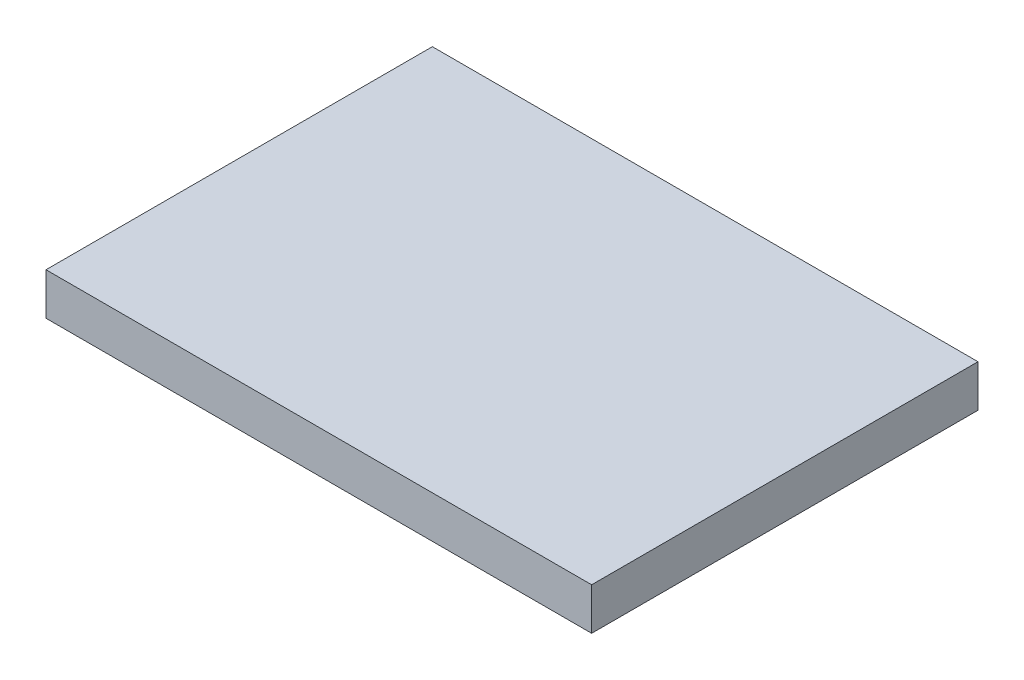
ISO-10303-21;
HEADER;
FILE_DESCRIPTION(('STEP AP214'),'2;1');
FILE_NAME('part.step','',(''),(''),'','','');
FILE_SCHEMA(('AUTOMOTIVE_DESIGN { 1 0 10303 214 1 1 1 1 }'));
ENDSEC;
DATA;
#1=APPLICATION_CONTEXT('core data for automotive mechanical design processes');
#2=APPLICATION_PROTOCOL_DEFINITION('international standard','automotive_design',2000,#1);
#3=PRODUCT_CONTEXT('',#1,'mechanical');
#4=PRODUCT('Part','Part','',(#3));
#5=PRODUCT_RELATED_PRODUCT_CATEGORY('part','',(#4));
#6=PRODUCT_DEFINITION_FORMATION('','',#4);
#7=PRODUCT_DEFINITION_CONTEXT('part definition',#1,'design');
#8=PRODUCT_DEFINITION('design','',#6,#7);
#9=PRODUCT_DEFINITION_SHAPE('','',#8);
#10=(LENGTH_UNIT() NAMED_UNIT(*) SI_UNIT(.MILLI.,.METRE.));
#11=(NAMED_UNIT(*) PLANE_ANGLE_UNIT() SI_UNIT($,.RADIAN.));
#12=(NAMED_UNIT(*) SI_UNIT($,.STERADIAN.) SOLID_ANGLE_UNIT());
#13=UNCERTAINTY_MEASURE_WITH_UNIT(LENGTH_MEASURE(1.E-05),#10,'distance_accuracy_value','');
#14=(GEOMETRIC_REPRESENTATION_CONTEXT(3) GLOBAL_UNCERTAINTY_ASSIGNED_CONTEXT((#13)) GLOBAL_UNIT_ASSIGNED_CONTEXT((#10,
#11,#12)) REPRESENTATION_CONTEXT('',''));
#15=CARTESIAN_POINT('',(0.,0.,0.));
#16=DIRECTION('',(0.,0.,1.));
#17=DIRECTION('',(1.,0.,0.));
#18=AXIS2_PLACEMENT_3D('',#15,#16,#17);
#19=CARTESIAN_POINT('',(0.,9.,0.));
#20=DIRECTION('',(1.,0.,0.));
#21=DIRECTION('',(0.,0.,-1.));
#22=AXIS2_PLACEMENT_3D('',#19,#20,#21);
#23=PLANE('',#22);
#24=DIRECTION('',(0.,0.,1.));
#25=VECTOR('',#24,1.);
#26=CARTESIAN_POINT('',(0.,0.,0.));
#27=LINE('',#26,#25);
#28=CARTESIAN_POINT('',(0.,0.,-82.7));
#29=VERTEX_POINT('',#28);
#30=CARTESIAN_POINT('',(0.,0.,0.));
#31=VERTEX_POINT('',#30);
#32=EDGE_CURVE('E111',#29,#31,#27,.T.);
#33=ORIENTED_EDGE('',*,*,#32,.T.);
#34=DIRECTION('',(0.,-1.,0.));
#35=VECTOR('',#34,1.);
#36=CARTESIAN_POINT('',(0.,9.,0.));
#37=LINE('',#36,#35);
#38=CARTESIAN_POINT('',(0.,9.,0.));
#39=VERTEX_POINT('',#38);
#40=EDGE_CURVE('E11',#39,#31,#37,.T.);
#41=ORIENTED_EDGE('',*,*,#40,.F.);
#42=DIRECTION('',(0.,0.,1.));
#43=VECTOR('',#42,1.);
#44=CARTESIAN_POINT('',(0.,9.,0.));
#45=LINE('',#44,#43);
#46=CARTESIAN_POINT('',(0.,9.,-82.7));
#47=VERTEX_POINT('',#46);
#48=EDGE_CURVE('E95',#47,#39,#45,.T.);
#49=ORIENTED_EDGE('',*,*,#48,.F.);
#50=DIRECTION('',(0.,-1.,0.));
#51=VECTOR('',#50,1.);
#52=CARTESIAN_POINT('',(0.,9.,-82.7));
#53=LINE('',#52,#51);
#54=EDGE_CURVE('E107',#47,#29,#53,.T.);
#55=ORIENTED_EDGE('',*,*,#54,.T.);
#56=EDGE_LOOP('',(#33,#41,#49,#55));
#57=FACE_BOUND('',#56,.T.);
#58=ADVANCED_FACE('F38',(#57),#23,.F.);
#59=CARTESIAN_POINT('',(0.,9.,0.));
#60=DIRECTION('',(0.,0.,-1.));
#61=DIRECTION('',(-1.,0.,0.));
#62=AXIS2_PLACEMENT_3D('',#59,#60,#61);
#63=PLANE('',#62);
#64=DIRECTION('',(1.,0.,0.));
#65=VECTOR('',#64,1.);
#66=CARTESIAN_POINT('',(0.,0.,0.));
#67=LINE('',#66,#65);
#68=CARTESIAN_POINT('',(116.8,0.,0.));
#69=VERTEX_POINT('',#68);
#70=EDGE_CURVE('E100',#31,#69,#67,.T.);
#71=ORIENTED_EDGE('',*,*,#70,.T.);
#72=DIRECTION('',(0.,-1.,0.));
#73=VECTOR('',#72,1.);
#74=CARTESIAN_POINT('',(116.8,9.,0.));
#75=LINE('',#74,#73);
#76=CARTESIAN_POINT('',(116.8,9.,0.));
#77=VERTEX_POINT('',#76);
#78=EDGE_CURVE('E47',#77,#69,#75,.T.);
#79=ORIENTED_EDGE('',*,*,#78,.F.);
#80=DIRECTION('',(1.,0.,0.));
#81=VECTOR('',#80,1.);
#82=CARTESIAN_POINT('',(0.,9.,0.));
#83=LINE('',#82,#81);
#84=EDGE_CURVE('E90',#39,#77,#83,.T.);
#85=ORIENTED_EDGE('',*,*,#84,.F.);
#86=ORIENTED_EDGE('',*,*,#40,.T.);
#87=EDGE_LOOP('',(#71,#79,#85,#86));
#88=FACE_BOUND('',#87,.T.);
#89=ADVANCED_FACE('F99',(#88),#63,.F.);
#90=CARTESIAN_POINT('',(116.8,9.,0.));
#91=DIRECTION('',(-1.,0.,0.));
#92=DIRECTION('',(0.,0.,1.));
#93=AXIS2_PLACEMENT_3D('',#90,#91,#92);
#94=PLANE('',#93);
#95=DIRECTION('',(0.,0.,-1.));
#96=VECTOR('',#95,1.);
#97=CARTESIAN_POINT('',(116.8,0.,0.));
#98=LINE('',#97,#96);
#99=CARTESIAN_POINT('',(116.8,0.,-82.7));
#100=VERTEX_POINT('',#99);
#101=EDGE_CURVE('E76',#69,#100,#98,.T.);
#102=ORIENTED_EDGE('',*,*,#101,.T.);
#103=DIRECTION('',(0.,-1.,0.));
#104=VECTOR('',#103,1.);
#105=CARTESIAN_POINT('',(116.8,9.,-82.7));
#106=LINE('',#105,#104);
#107=CARTESIAN_POINT('',(116.8,9.,-82.7));
#108=VERTEX_POINT('',#107);
#109=EDGE_CURVE('E102',#108,#100,#106,.T.);
#110=ORIENTED_EDGE('',*,*,#109,.F.);
#111=DIRECTION('',(0.,0.,-1.));
#112=VECTOR('',#111,1.);
#113=CARTESIAN_POINT('',(116.8,9.,0.));
#114=LINE('',#113,#112);
#115=EDGE_CURVE('E93',#77,#108,#114,.T.);
#116=ORIENTED_EDGE('',*,*,#115,.F.);
#117=ORIENTED_EDGE('',*,*,#78,.T.);
#118=EDGE_LOOP('',(#102,#110,#116,#117));
#119=FACE_BOUND('',#118,.T.);
#120=ADVANCED_FACE('F103',(#119),#94,.F.);
#121=CARTESIAN_POINT('',(0.,9.,-82.7));
#122=DIRECTION('',(0.,0.,1.));
#123=DIRECTION('',(1.,0.,0.));
#124=AXIS2_PLACEMENT_3D('',#121,#122,#123);
#125=PLANE('',#124);
#126=DIRECTION('',(-1.,0.,0.));
#127=VECTOR('',#126,1.);
#128=CARTESIAN_POINT('',(0.,0.,-82.7));
#129=LINE('',#128,#127);
#130=EDGE_CURVE('E82',#100,#29,#129,.T.);
#131=ORIENTED_EDGE('',*,*,#130,.T.);
#132=ORIENTED_EDGE('',*,*,#54,.F.);
#133=DIRECTION('',(-1.,0.,0.));
#134=VECTOR('',#133,1.);
#135=CARTESIAN_POINT('',(0.,9.,-82.7));
#136=LINE('',#135,#134);
#137=EDGE_CURVE('E55',#108,#47,#136,.T.);
#138=ORIENTED_EDGE('',*,*,#137,.F.);
#139=ORIENTED_EDGE('',*,*,#109,.T.);
#140=EDGE_LOOP('',(#131,#132,#138,#139));
#141=FACE_BOUND('',#140,.T.);
#142=ADVANCED_FACE('F123',(#141),#125,.F.);
#143=CARTESIAN_POINT('',(0.,9.,0.));
#144=DIRECTION('',(0.,-1.,0.));
#145=DIRECTION('',(0.,0.,-1.));
#146=AXIS2_PLACEMENT_3D('',#143,#144,#145);
#147=PLANE('',#146);
#148=ORIENTED_EDGE('',*,*,#48,.T.);
#149=ORIENTED_EDGE('',*,*,#84,.T.);
#150=ORIENTED_EDGE('',*,*,#115,.T.);
#151=ORIENTED_EDGE('',*,*,#137,.T.);
#152=EDGE_LOOP('',(#148,#149,#150,#151));
#153=FACE_BOUND('',#152,.T.);
#154=ADVANCED_FACE('F91',(#153),#147,.F.);
#155=CARTESIAN_POINT('',(0.,0.,0.));
#156=DIRECTION('',(0.,-1.,0.));
#157=DIRECTION('',(0.,0.,-1.));
#158=AXIS2_PLACEMENT_3D('',#155,#156,#157);
#159=PLANE('',#158);
#160=ORIENTED_EDGE('',*,*,#32,.F.);
#161=ORIENTED_EDGE('',*,*,#130,.F.);
#162=ORIENTED_EDGE('',*,*,#101,.F.);
#163=ORIENTED_EDGE('',*,*,#70,.F.);
#164=EDGE_LOOP('',(#160,#161,#162,#163));
#165=FACE_BOUND('',#164,.T.);
#166=ADVANCED_FACE('F126',(#165),#159,.T.);
#167=CLOSED_SHELL('',(#58,#89,#120,#142,#154,#166));
#168=MANIFOLD_SOLID_BREP('B2',#167);
#169=ADVANCED_BREP_SHAPE_REPRESENTATION('',(#18,#168),#14);
#170=SHAPE_DEFINITION_REPRESENTATION(#9,#169);
ENDSEC;
END-ISO-10303-21;
